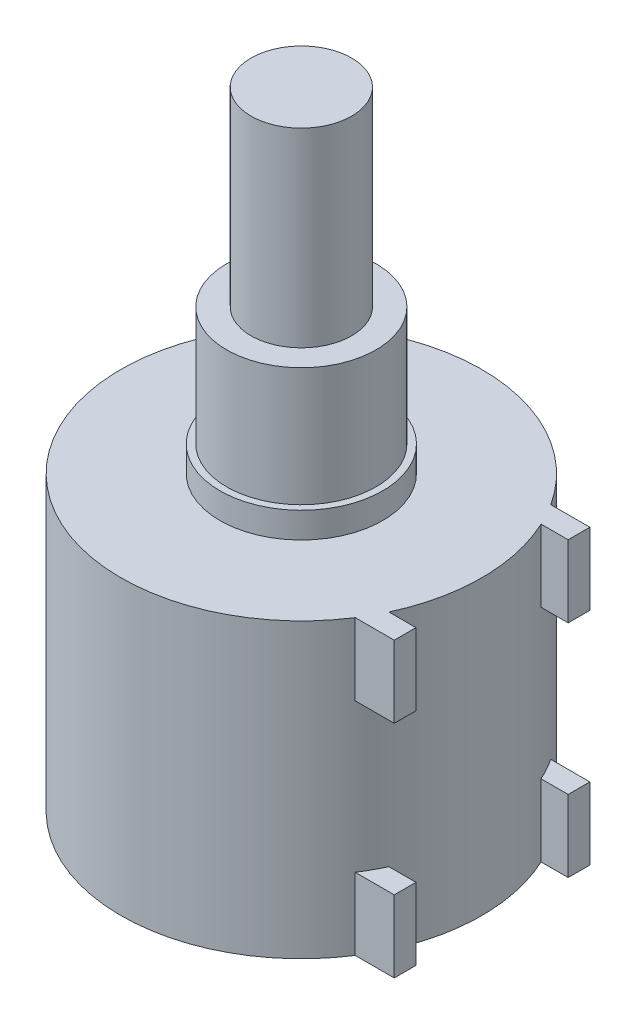
ISO-10303-21;
HEADER;
FILE_DESCRIPTION(('STEP AP214'),'2;1');
FILE_NAME('part.step','',(''),(''),'','','');
FILE_SCHEMA(('AUTOMOTIVE_DESIGN { 1 0 10303 214 1 1 1 1 }'));
ENDSEC;
DATA;
#1=APPLICATION_CONTEXT('core data for automotive mechanical design processes');
#2=APPLICATION_PROTOCOL_DEFINITION('international standard','automotive_design',2000,#1);
#3=PRODUCT_CONTEXT('',#1,'mechanical');
#4=PRODUCT('Part','Part','',(#3));
#5=PRODUCT_RELATED_PRODUCT_CATEGORY('part','',(#4));
#6=PRODUCT_DEFINITION_FORMATION('','',#4);
#7=PRODUCT_DEFINITION_CONTEXT('part definition',#1,'design');
#8=PRODUCT_DEFINITION('design','',#6,#7);
#9=PRODUCT_DEFINITION_SHAPE('','',#8);
#10=(LENGTH_UNIT() NAMED_UNIT(*) SI_UNIT(.MILLI.,.METRE.));
#11=(NAMED_UNIT(*) PLANE_ANGLE_UNIT() SI_UNIT($,.RADIAN.));
#12=(NAMED_UNIT(*) SI_UNIT($,.STERADIAN.) SOLID_ANGLE_UNIT());
#13=UNCERTAINTY_MEASURE_WITH_UNIT(LENGTH_MEASURE(1.E-05),#10,'distance_accuracy_value','');
#14=(GEOMETRIC_REPRESENTATION_CONTEXT(3) GLOBAL_UNCERTAINTY_ASSIGNED_CONTEXT((#13)) GLOBAL_UNIT_ASSIGNED_CONTEXT((#10,
#11,#12)) REPRESENTATION_CONTEXT('',''));
#15=CARTESIAN_POINT('',(0.,0.,0.));
#16=DIRECTION('',(0.,0.,1.));
#17=DIRECTION('',(1.,0.,0.));
#18=AXIS2_PLACEMENT_3D('',#15,#16,#17);
#19=CARTESIAN_POINT('',(0.,0.,0.));
#20=DIRECTION('',(0.,1.,0.));
#21=DIRECTION('',(-1.,0.,0.));
#22=AXIS2_PLACEMENT_3D('',#19,#20,#21);
#23=CYLINDRICAL_SURFACE('',#22,11.2014);
#24=CARTESIAN_POINT('',(0.,18.161,0.));
#25=DIRECTION('',(0.,1.,0.));
#26=DIRECTION('',(-1.,0.,0.));
#27=AXIS2_PLACEMENT_3D('',#24,#25,#26);
#28=CIRCLE('',#27,11.2014);
#29=CARTESIAN_POINT('',(9.4137759480455,18.161,-6.0706));
#30=VERTEX_POINT('',#29);
#31=CARTESIAN_POINT('',(9.4137759480455,18.161,6.0706));
#32=VERTEX_POINT('',#31);
#33=EDGE_CURVE('E262',#30,#32,#28,.T.);
#34=ORIENTED_EDGE('',*,*,#33,.F.);
#35=DIRECTION('',(0.,1.,0.));
#36=VECTOR('',#35,1.);
#37=CARTESIAN_POINT('',(9.4137759480455,0.,-6.0706));
#38=LINE('',#37,#36);
#39=CARTESIAN_POINT('',(9.4137759480455,13.6906,-6.0706));
#40=VERTEX_POINT('',#39);
#41=EDGE_CURVE('E187',#40,#30,#38,.T.);
#42=ORIENTED_EDGE('',*,*,#41,.F.);
#43=CARTESIAN_POINT('',(0.,13.6906,0.));
#44=DIRECTION('',(0.,1.,0.));
#45=DIRECTION('',(0.,0.,1.));
#46=AXIS2_PLACEMENT_3D('',#43,#44,#45);
#47=CIRCLE('',#46,11.2014);
#48=CARTESIAN_POINT('',(10.1563480936801,13.6906,-4.7244));
#49=VERTEX_POINT('',#48);
#50=EDGE_CURVE('E192',#49,#40,#47,.T.);
#51=ORIENTED_EDGE('',*,*,#50,.F.);
#52=DIRECTION('',(0.,1.,0.));
#53=VECTOR('',#52,1.);
#54=CARTESIAN_POINT('',(10.1563480936801,0.,-4.72440000000001));
#55=LINE('',#54,#53);
#56=CARTESIAN_POINT('',(10.1563480936801,18.161,-4.7244));
#57=VERTEX_POINT('',#56);
#58=EDGE_CURVE('E197',#57,#49,#55,.F.);
#59=ORIENTED_EDGE('',*,*,#58,.F.);
#60=CARTESIAN_POINT('',(10.1563480936801,18.161,4.7244));
#61=VERTEX_POINT('',#60);
#62=EDGE_CURVE('E158',#61,#57,#28,.T.);
#63=ORIENTED_EDGE('',*,*,#62,.F.);
#64=DIRECTION('',(0.,1.,0.));
#65=VECTOR('',#64,1.);
#66=CARTESIAN_POINT('',(10.1563480936801,0.,4.72440000000001));
#67=LINE('',#66,#65);
#68=CARTESIAN_POINT('',(10.1563480936801,13.6906,4.72440000000001));
#69=VERTEX_POINT('',#68);
#70=EDGE_CURVE('E241',#61,#69,#67,.F.);
#71=ORIENTED_EDGE('',*,*,#70,.T.);
#72=CARTESIAN_POINT('',(0.,13.6906,0.));
#73=DIRECTION('',(0.,-1.,0.));
#74=DIRECTION('',(0.,0.,-1.));
#75=AXIS2_PLACEMENT_3D('',#72,#73,#74);
#76=CIRCLE('',#75,11.2014);
#77=CARTESIAN_POINT('',(9.4137759480455,13.6906,6.0706));
#78=VERTEX_POINT('',#77);
#79=EDGE_CURVE('E253',#69,#78,#76,.T.);
#80=ORIENTED_EDGE('',*,*,#79,.T.);
#81=DIRECTION('',(0.,1.,0.));
#82=VECTOR('',#81,1.);
#83=CARTESIAN_POINT('',(9.4137759480455,0.,6.0706));
#84=LINE('',#83,#82);
#85=EDGE_CURVE('E257',#78,#32,#84,.T.);
#86=ORIENTED_EDGE('',*,*,#85,.T.);
#87=EDGE_LOOP('',(#34,#42,#51,#59,#63,#71,#80,#86));
#88=FACE_BOUND('',#87,.T.);
#89=CARTESIAN_POINT('',(0.,4.4704,0.));
#90=DIRECTION('',(0.,-1.,0.));
#91=DIRECTION('',(0.,0.,-1.));
#92=AXIS2_PLACEMENT_3D('',#89,#90,#91);
#93=CIRCLE('',#92,11.2014);
#94=CARTESIAN_POINT('',(9.4137759480455,4.4704,-6.0706));
#95=VERTEX_POINT('',#94);
#96=CARTESIAN_POINT('',(10.1563480936801,4.4704,-4.7244));
#97=VERTEX_POINT('',#96);
#98=EDGE_CURVE('E50',#95,#97,#93,.T.);
#99=ORIENTED_EDGE('',*,*,#98,.F.);
#100=DIRECTION('',(0.,1.,0.));
#101=VECTOR('',#100,1.);
#102=CARTESIAN_POINT('',(9.4137759480455,0.,-6.0706));
#103=LINE('',#102,#101);
#104=CARTESIAN_POINT('',(9.4137759480455,0.,-6.0706));
#105=VERTEX_POINT('',#104);
#106=EDGE_CURVE('E160',#105,#95,#103,.T.);
#107=ORIENTED_EDGE('',*,*,#106,.F.);
#108=CARTESIAN_POINT('',(0.,0.,0.));
#109=DIRECTION('',(0.,1.,0.));
#110=DIRECTION('',(-1.,0.,0.));
#111=AXIS2_PLACEMENT_3D('',#108,#109,#110);
#112=CIRCLE('',#111,11.2014);
#113=CARTESIAN_POINT('',(9.4137759480455,0.,6.0706));
#114=VERTEX_POINT('',#113);
#115=EDGE_CURVE('E147',#105,#114,#112,.T.);
#116=ORIENTED_EDGE('',*,*,#115,.T.);
#117=DIRECTION('',(0.,1.,0.));
#118=VECTOR('',#117,1.);
#119=CARTESIAN_POINT('',(9.4137759480455,0.,6.0706));
#120=LINE('',#119,#118);
#121=CARTESIAN_POINT('',(9.4137759480455,4.4704,6.0706));
#122=VERTEX_POINT('',#121);
#123=EDGE_CURVE('E215',#114,#122,#120,.T.);
#124=ORIENTED_EDGE('',*,*,#123,.T.);
#125=CARTESIAN_POINT('',(0.,4.4704,0.));
#126=DIRECTION('',(0.,1.,0.));
#127=DIRECTION('',(0.,0.,1.));
#128=AXIS2_PLACEMENT_3D('',#125,#126,#127);
#129=CIRCLE('',#128,11.2014);
#130=CARTESIAN_POINT('',(10.1563480936801,4.4704,4.7244));
#131=VERTEX_POINT('',#130);
#132=EDGE_CURVE('E227',#122,#131,#129,.T.);
#133=ORIENTED_EDGE('',*,*,#132,.T.);
#134=DIRECTION('',(0.,1.,0.));
#135=VECTOR('',#134,1.);
#136=CARTESIAN_POINT('',(10.1563480936801,0.,4.7244));
#137=LINE('',#136,#135);
#138=CARTESIAN_POINT('',(10.1563480936801,0.,4.7244));
#139=VERTEX_POINT('',#138);
#140=EDGE_CURVE('E231',#131,#139,#137,.F.);
#141=ORIENTED_EDGE('',*,*,#140,.T.);
#142=CARTESIAN_POINT('',(10.1563480936801,0.,-4.7244));
#143=VERTEX_POINT('',#142);
#144=EDGE_CURVE('E157',#139,#143,#112,.T.);
#145=ORIENTED_EDGE('',*,*,#144,.T.);
#146=DIRECTION('',(0.,1.,0.));
#147=VECTOR('',#146,1.);
#148=CARTESIAN_POINT('',(10.1563480936801,0.,-4.7244));
#149=LINE('',#148,#147);
#150=EDGE_CURVE('E55',#97,#143,#149,.F.);
#151=ORIENTED_EDGE('',*,*,#150,.F.);
#152=EDGE_LOOP('',(#99,#107,#116,#124,#133,#141,#145,#151));
#153=FACE_BOUND('',#152,.T.);
#154=ADVANCED_FACE('F35',(#88,#153),#23,.T.);
#155=CARTESIAN_POINT('',(-11.2014,18.161,0.));
#156=DIRECTION('',(0.,1.,0.));
#157=DIRECTION('',(-1.,0.,0.));
#158=AXIS2_PLACEMENT_3D('',#155,#156,#157);
#159=PLANE('',#158);
#160=ORIENTED_EDGE('',*,*,#62,.T.);
#161=DIRECTION('',(1.,0.,0.));
#162=VECTOR('',#161,1.);
#163=CARTESIAN_POINT('',(-11.2024,18.161,-4.7244));
#164=LINE('',#163,#162);
#165=CARTESIAN_POINT('',(11.8364,18.161,-4.7244));
#166=VERTEX_POINT('',#165);
#167=EDGE_CURVE('E188',#57,#166,#164,.T.);
#168=ORIENTED_EDGE('',*,*,#167,.T.);
#169=DIRECTION('',(0.,0.,-1.));
#170=VECTOR('',#169,1.);
#171=CARTESIAN_POINT('',(11.8364,18.161,-6.0706));
#172=LINE('',#171,#170);
#173=CARTESIAN_POINT('',(11.8364,18.161,-6.0706));
#174=VERTEX_POINT('',#173);
#175=EDGE_CURVE('E184',#166,#174,#172,.T.);
#176=ORIENTED_EDGE('',*,*,#175,.T.);
#177=DIRECTION('',(1.,0.,0.));
#178=VECTOR('',#177,1.);
#179=CARTESIAN_POINT('',(-11.2024,18.161,-6.0706));
#180=LINE('',#179,#178);
#181=EDGE_CURVE('E193',#30,#174,#180,.T.);
#182=ORIENTED_EDGE('',*,*,#181,.F.);
#183=ORIENTED_EDGE('',*,*,#33,.T.);
#184=DIRECTION('',(1.,0.,0.));
#185=VECTOR('',#184,1.);
#186=CARTESIAN_POINT('',(-11.2024,18.161,6.0706));
#187=LINE('',#186,#185);
#188=CARTESIAN_POINT('',(11.8364,18.161,6.0706));
#189=VERTEX_POINT('',#188);
#190=EDGE_CURVE('E255',#32,#189,#187,.T.);
#191=ORIENTED_EDGE('',*,*,#190,.T.);
#192=DIRECTION('',(0.,0.,1.));
#193=VECTOR('',#192,1.);
#194=CARTESIAN_POINT('',(11.8364,18.161,6.0706));
#195=LINE('',#194,#193);
#196=CARTESIAN_POINT('',(11.8364,18.161,4.7244));
#197=VERTEX_POINT('',#196);
#198=EDGE_CURVE('E245',#197,#189,#195,.T.);
#199=ORIENTED_EDGE('',*,*,#198,.F.);
#200=DIRECTION('',(1.,0.,0.));
#201=VECTOR('',#200,1.);
#202=CARTESIAN_POINT('',(-11.2024,18.161,4.7244));
#203=LINE('',#202,#201);
#204=EDGE_CURVE('E251',#61,#197,#203,.T.);
#205=ORIENTED_EDGE('',*,*,#204,.F.);
#206=EDGE_LOOP('',(#160,#168,#176,#182,#183,#191,#199,#205));
#207=FACE_BOUND('',#206,.T.);
#208=CARTESIAN_POINT('',(0.,18.161,0.));
#209=DIRECTION('',(0.,1.,0.));
#210=DIRECTION('',(-1.,0.,0.));
#211=AXIS2_PLACEMENT_3D('',#208,#209,#210);
#212=CIRCLE('',#211,5.0546);
#213=CARTESIAN_POINT('',(-5.0546,18.161,0.));
#214=VERTEX_POINT('',#213);
#215=EDGE_CURVE('E11',#214,#214,#212,.T.);
#216=ORIENTED_EDGE('',*,*,#215,.F.);
#217=EDGE_LOOP('',(#216));
#218=FACE_BOUND('',#217,.T.);
#219=ADVANCED_FACE('F37',(#207,#218),#159,.T.);
#220=CARTESIAN_POINT('',(0.,0.,0.));
#221=DIRECTION('',(0.,1.,0.));
#222=DIRECTION('',(-1.,0.,0.));
#223=AXIS2_PLACEMENT_3D('',#220,#221,#222);
#224=CYLINDRICAL_SURFACE('',#223,5.0546);
#225=ORIENTED_EDGE('',*,*,#215,.T.);
#226=EDGE_LOOP('',(#225));
#227=FACE_BOUND('',#226,.T.);
#228=CARTESIAN_POINT('',(0.,19.7612,0.));
#229=DIRECTION('',(0.,1.,0.));
#230=DIRECTION('',(-1.,0.,0.));
#231=AXIS2_PLACEMENT_3D('',#228,#229,#230);
#232=CIRCLE('',#231,5.0546);
#233=CARTESIAN_POINT('',(-5.0546,19.7612,0.));
#234=VERTEX_POINT('',#233);
#235=EDGE_CURVE('E43',#234,#234,#232,.T.);
#236=ORIENTED_EDGE('',*,*,#235,.F.);
#237=EDGE_LOOP('',(#236));
#238=FACE_BOUND('',#237,.T.);
#239=ADVANCED_FACE('F284',(#227,#238),#224,.T.);
#240=CARTESIAN_POINT('',(-4.6355,19.7612,0.));
#241=DIRECTION('',(0.,1.,0.));
#242=DIRECTION('',(-1.,0.,0.));
#243=AXIS2_PLACEMENT_3D('',#240,#241,#242);
#244=PLANE('',#243);
#245=ORIENTED_EDGE('',*,*,#235,.T.);
#246=EDGE_LOOP('',(#245));
#247=FACE_BOUND('',#246,.T.);
#248=CARTESIAN_POINT('',(0.,19.7612,0.));
#249=DIRECTION('',(0.,1.,0.));
#250=DIRECTION('',(-1.,0.,0.));
#251=AXIS2_PLACEMENT_3D('',#248,#249,#250);
#252=CIRCLE('',#251,4.6355);
#253=CARTESIAN_POINT('',(-4.6355,19.7612,0.));
#254=VERTEX_POINT('',#253);
#255=EDGE_CURVE('E276',#254,#254,#252,.T.);
#256=ORIENTED_EDGE('',*,*,#255,.F.);
#257=EDGE_LOOP('',(#256));
#258=FACE_BOUND('',#257,.T.);
#259=ADVANCED_FACE('F281',(#247,#258),#244,.T.);
#260=CARTESIAN_POINT('',(0.,0.,0.));
#261=DIRECTION('',(0.,1.,0.));
#262=DIRECTION('',(-1.,0.,0.));
#263=AXIS2_PLACEMENT_3D('',#260,#261,#262);
#264=CYLINDRICAL_SURFACE('',#263,4.6355);
#265=ORIENTED_EDGE('',*,*,#255,.T.);
#266=EDGE_LOOP('',(#265));
#267=FACE_BOUND('',#266,.T.);
#268=CARTESIAN_POINT('',(0.,27.1272,0.));
#269=DIRECTION('',(0.,1.,0.));
#270=DIRECTION('',(-1.,0.,0.));
#271=AXIS2_PLACEMENT_3D('',#268,#269,#270);
#272=CIRCLE('',#271,4.6355);
#273=CARTESIAN_POINT('',(-4.6355,27.1272,0.));
#274=VERTEX_POINT('',#273);
#275=EDGE_CURVE('E273',#274,#274,#272,.T.);
#276=ORIENTED_EDGE('',*,*,#275,.F.);
#277=EDGE_LOOP('',(#276));
#278=FACE_BOUND('',#277,.T.);
#279=ADVANCED_FACE('F291',(#267,#278),#264,.T.);
#280=CARTESIAN_POINT('',(-4.6355,27.1272,0.));
#281=DIRECTION('',(0.,1.,0.));
#282=DIRECTION('',(-1.,0.,0.));
#283=AXIS2_PLACEMENT_3D('',#280,#281,#282);
#284=PLANE('',#283);
#285=ORIENTED_EDGE('',*,*,#275,.T.);
#286=EDGE_LOOP('',(#285));
#287=FACE_BOUND('',#286,.T.);
#288=CARTESIAN_POINT('',(0.,27.1272,0.));
#289=DIRECTION('',(0.,1.,0.));
#290=DIRECTION('',(-1.,0.,0.));
#291=AXIS2_PLACEMENT_3D('',#288,#289,#290);
#292=CIRCLE('',#291,3.1242);
#293=CARTESIAN_POINT('',(-3.1242,27.1272,0.));
#294=VERTEX_POINT('',#293);
#295=EDGE_CURVE('E270',#294,#294,#292,.T.);
#296=ORIENTED_EDGE('',*,*,#295,.F.);
#297=EDGE_LOOP('',(#296));
#298=FACE_BOUND('',#297,.T.);
#299=ADVANCED_FACE('F314',(#287,#298),#284,.T.);
#300=CARTESIAN_POINT('',(0.,0.,0.));
#301=DIRECTION('',(0.,1.,0.));
#302=DIRECTION('',(-1.,0.,0.));
#303=AXIS2_PLACEMENT_3D('',#300,#301,#302);
#304=CYLINDRICAL_SURFACE('',#303,3.1242);
#305=ORIENTED_EDGE('',*,*,#295,.T.);
#306=EDGE_LOOP('',(#305));
#307=FACE_BOUND('',#306,.T.);
#308=CARTESIAN_POINT('',(0.,38.9382,0.));
#309=DIRECTION('',(0.,1.,0.));
#310=DIRECTION('',(-1.,0.,0.));
#311=AXIS2_PLACEMENT_3D('',#308,#309,#310);
#312=CIRCLE('',#311,3.1242);
#313=CARTESIAN_POINT('',(-3.1242,38.9382,0.));
#314=VERTEX_POINT('',#313);
#315=EDGE_CURVE('E267',#314,#314,#312,.T.);
#316=ORIENTED_EDGE('',*,*,#315,.F.);
#317=EDGE_LOOP('',(#316));
#318=FACE_BOUND('',#317,.T.);
#319=ADVANCED_FACE('F310',(#307,#318),#304,.T.);
#320=CARTESIAN_POINT('',(-3.1242,38.9382,0.));
#321=DIRECTION('',(0.,1.,0.));
#322=DIRECTION('',(-1.,0.,0.));
#323=AXIS2_PLACEMENT_3D('',#320,#321,#322);
#324=PLANE('',#323);
#325=ORIENTED_EDGE('',*,*,#315,.T.);
#326=EDGE_LOOP('',(#325));
#327=FACE_BOUND('',#326,.T.);
#328=ADVANCED_FACE('F307',(#327),#324,.T.);
#329=CARTESIAN_POINT('',(-11.2014,0.,0.));
#330=DIRECTION('',(0.,-1.,0.));
#331=DIRECTION('',(1.,0.,0.));
#332=AXIS2_PLACEMENT_3D('',#329,#330,#331);
#333=PLANE('',#332);
#334=ORIENTED_EDGE('',*,*,#144,.F.);
#335=DIRECTION('',(1.,0.,0.));
#336=VECTOR('',#335,1.);
#337=CARTESIAN_POINT('',(-11.2024,0.,4.7244));
#338=LINE('',#337,#336);
#339=CARTESIAN_POINT('',(11.8364,0.,4.7244));
#340=VERTEX_POINT('',#339);
#341=EDGE_CURVE('E233',#139,#340,#338,.T.);
#342=ORIENTED_EDGE('',*,*,#341,.T.);
#343=DIRECTION('',(0.,0.,-1.));
#344=VECTOR('',#343,1.);
#345=CARTESIAN_POINT('',(11.8364,0.,6.0706));
#346=LINE('',#345,#344);
#347=CARTESIAN_POINT('',(11.8364,0.,6.0706));
#348=VERTEX_POINT('',#347);
#349=EDGE_CURVE('E219',#348,#340,#346,.T.);
#350=ORIENTED_EDGE('',*,*,#349,.F.);
#351=DIRECTION('',(1.,0.,0.));
#352=VECTOR('',#351,1.);
#353=CARTESIAN_POINT('',(-11.2024,0.,6.0706));
#354=LINE('',#353,#352);
#355=EDGE_CURVE('E155',#114,#348,#354,.T.);
#356=ORIENTED_EDGE('',*,*,#355,.F.);
#357=ORIENTED_EDGE('',*,*,#115,.F.);
#358=DIRECTION('',(1.,0.,0.));
#359=VECTOR('',#358,1.);
#360=CARTESIAN_POINT('',(-11.2024,0.,-6.0706));
#361=LINE('',#360,#359);
#362=CARTESIAN_POINT('',(11.8364,0.,-6.0706));
#363=VERTEX_POINT('',#362);
#364=EDGE_CURVE('E152',#105,#363,#361,.T.);
#365=ORIENTED_EDGE('',*,*,#364,.T.);
#366=DIRECTION('',(0.,0.,1.));
#367=VECTOR('',#366,1.);
#368=CARTESIAN_POINT('',(11.8364,0.,-6.0706));
#369=LINE('',#368,#367);
#370=CARTESIAN_POINT('',(11.8364,0.,-4.7244));
#371=VERTEX_POINT('',#370);
#372=EDGE_CURVE('E169',#363,#371,#369,.T.);
#373=ORIENTED_EDGE('',*,*,#372,.T.);
#374=DIRECTION('',(1.,0.,0.));
#375=VECTOR('',#374,1.);
#376=CARTESIAN_POINT('',(-11.2024,0.,-4.7244));
#377=LINE('',#376,#375);
#378=EDGE_CURVE('E175',#143,#371,#377,.T.);
#379=ORIENTED_EDGE('',*,*,#378,.F.);
#380=EDGE_LOOP('',(#334,#342,#350,#356,#357,#365,#373,#379));
#381=FACE_BOUND('',#380,.T.);
#382=ADVANCED_FACE('F149',(#381),#333,.T.);
#383=CARTESIAN_POINT('',(-11.2024,13.6906,6.0706));
#384=DIRECTION('',(0.,-1.,0.));
#385=DIRECTION('',(0.,0.,-1.));
#386=AXIS2_PLACEMENT_3D('',#383,#384,#385);
#387=PLANE('',#386);
#388=ORIENTED_EDGE('',*,*,#79,.F.);
#389=DIRECTION('',(1.,0.,0.));
#390=VECTOR('',#389,1.);
#391=CARTESIAN_POINT('',(-11.2024,13.6906,4.7244));
#392=LINE('',#391,#390);
#393=CARTESIAN_POINT('',(11.8364,13.6906,4.7244));
#394=VERTEX_POINT('',#393);
#395=EDGE_CURVE('E235',#69,#394,#392,.T.);
#396=ORIENTED_EDGE('',*,*,#395,.T.);
#397=DIRECTION('',(0.,0.,-1.));
#398=VECTOR('',#397,1.);
#399=CARTESIAN_POINT('',(11.8364,13.6906,6.0706));
#400=LINE('',#399,#398);
#401=CARTESIAN_POINT('',(11.8364,13.6906,6.0706));
#402=VERTEX_POINT('',#401);
#403=EDGE_CURVE('E238',#402,#394,#400,.T.);
#404=ORIENTED_EDGE('',*,*,#403,.F.);
#405=DIRECTION('',(1.,0.,0.));
#406=VECTOR('',#405,1.);
#407=CARTESIAN_POINT('',(-11.2024,13.6906,6.0706));
#408=LINE('',#407,#406);
#409=EDGE_CURVE('E259',#78,#402,#408,.T.);
#410=ORIENTED_EDGE('',*,*,#409,.F.);
#411=EDGE_LOOP('',(#388,#396,#404,#410));
#412=FACE_BOUND('',#411,.T.);
#413=ADVANCED_FACE('F306',(#412),#387,.T.);
#414=CARTESIAN_POINT('',(-11.2024,18.161,6.0706));
#415=DIRECTION('',(0.,0.,1.));
#416=DIRECTION('',(1.,0.,0.));
#417=AXIS2_PLACEMENT_3D('',#414,#415,#416);
#418=PLANE('',#417);
#419=ORIENTED_EDGE('',*,*,#85,.F.);
#420=ORIENTED_EDGE('',*,*,#409,.T.);
#421=DIRECTION('',(0.,-1.,0.));
#422=VECTOR('',#421,1.);
#423=CARTESIAN_POINT('',(11.8364,18.161,6.0706));
#424=LINE('',#423,#422);
#425=EDGE_CURVE('E242',#189,#402,#424,.T.);
#426=ORIENTED_EDGE('',*,*,#425,.F.);
#427=ORIENTED_EDGE('',*,*,#190,.F.);
#428=EDGE_LOOP('',(#419,#420,#426,#427));
#429=FACE_BOUND('',#428,.T.);
#430=ADVANCED_FACE('F356',(#429),#418,.T.);
#431=CARTESIAN_POINT('',(-11.2024,18.161,4.7244));
#432=DIRECTION('',(0.,0.,-1.));
#433=DIRECTION('',(0.,1.,0.));
#434=AXIS2_PLACEMENT_3D('',#431,#432,#433);
#435=PLANE('',#434);
#436=ORIENTED_EDGE('',*,*,#70,.F.);
#437=ORIENTED_EDGE('',*,*,#204,.T.);
#438=DIRECTION('',(0.,1.,0.));
#439=VECTOR('',#438,1.);
#440=CARTESIAN_POINT('',(11.8364,18.161,4.7244));
#441=LINE('',#440,#439);
#442=EDGE_CURVE('E248',#394,#197,#441,.T.);
#443=ORIENTED_EDGE('',*,*,#442,.F.);
#444=ORIENTED_EDGE('',*,*,#395,.F.);
#445=EDGE_LOOP('',(#436,#437,#443,#444));
#446=FACE_BOUND('',#445,.T.);
#447=ADVANCED_FACE('F302',(#446),#435,.T.);
#448=CARTESIAN_POINT('',(11.8364,0.,0.));
#449=DIRECTION('',(1.,0.,0.));
#450=DIRECTION('',(0.,0.,-1.));
#451=AXIS2_PLACEMENT_3D('',#448,#449,#450);
#452=PLANE('',#451);
#453=ORIENTED_EDGE('',*,*,#442,.T.);
#454=ORIENTED_EDGE('',*,*,#198,.T.);
#455=ORIENTED_EDGE('',*,*,#425,.T.);
#456=ORIENTED_EDGE('',*,*,#403,.T.);
#457=EDGE_LOOP('',(#453,#454,#455,#456));
#458=FACE_BOUND('',#457,.T.);
#459=ADVANCED_FACE('F370',(#458),#452,.T.);
#460=CARTESIAN_POINT('',(-11.2024,0.,6.0706));
#461=DIRECTION('',(0.,0.,1.));
#462=DIRECTION('',(1.,0.,0.));
#463=AXIS2_PLACEMENT_3D('',#460,#461,#462);
#464=PLANE('',#463);
#465=ORIENTED_EDGE('',*,*,#123,.F.);
#466=ORIENTED_EDGE('',*,*,#355,.T.);
#467=DIRECTION('',(0.,-1.,0.));
#468=VECTOR('',#467,1.);
#469=CARTESIAN_POINT('',(11.8364,0.,6.0706));
#470=LINE('',#469,#468);
#471=CARTESIAN_POINT('',(11.8364,4.4704,6.0706));
#472=VERTEX_POINT('',#471);
#473=EDGE_CURVE('E222',#472,#348,#470,.T.);
#474=ORIENTED_EDGE('',*,*,#473,.F.);
#475=DIRECTION('',(1.,0.,0.));
#476=VECTOR('',#475,1.);
#477=CARTESIAN_POINT('',(-11.2024,4.4704,6.0706));
#478=LINE('',#477,#476);
#479=EDGE_CURVE('E229',#122,#472,#478,.T.);
#480=ORIENTED_EDGE('',*,*,#479,.F.);
#481=EDGE_LOOP('',(#465,#466,#474,#480));
#482=FACE_BOUND('',#481,.T.);
#483=ADVANCED_FACE('F377',(#482),#464,.T.);
#484=CARTESIAN_POINT('',(-11.2024,4.4704,6.0706));
#485=DIRECTION('',(0.,1.,0.));
#486=DIRECTION('',(0.,0.,1.));
#487=AXIS2_PLACEMENT_3D('',#484,#485,#486);
#488=PLANE('',#487);
#489=ORIENTED_EDGE('',*,*,#132,.F.);
#490=ORIENTED_EDGE('',*,*,#479,.T.);
#491=DIRECTION('',(0.,0.,1.));
#492=VECTOR('',#491,1.);
#493=CARTESIAN_POINT('',(11.8364,4.4704,6.0706));
#494=LINE('',#493,#492);
#495=CARTESIAN_POINT('',(11.8364,4.4704,4.7244));
#496=VERTEX_POINT('',#495);
#497=EDGE_CURVE('E212',#496,#472,#494,.T.);
#498=ORIENTED_EDGE('',*,*,#497,.F.);
#499=DIRECTION('',(1.,0.,0.));
#500=VECTOR('',#499,1.);
#501=CARTESIAN_POINT('',(-11.2024,4.4704,4.7244));
#502=LINE('',#501,#500);
#503=EDGE_CURVE('E225',#131,#496,#502,.T.);
#504=ORIENTED_EDGE('',*,*,#503,.F.);
#505=EDGE_LOOP('',(#489,#490,#498,#504));
#506=FACE_BOUND('',#505,.T.);
#507=ADVANCED_FACE('F385',(#506),#488,.T.);
#508=CARTESIAN_POINT('',(-11.2024,0.,4.7244));
#509=DIRECTION('',(0.,0.,-1.));
#510=DIRECTION('',(0.,1.,0.));
#511=AXIS2_PLACEMENT_3D('',#508,#509,#510);
#512=PLANE('',#511);
#513=ORIENTED_EDGE('',*,*,#140,.F.);
#514=ORIENTED_EDGE('',*,*,#503,.T.);
#515=DIRECTION('',(0.,1.,0.));
#516=VECTOR('',#515,1.);
#517=CARTESIAN_POINT('',(11.8364,0.,4.7244));
#518=LINE('',#517,#516);
#519=EDGE_CURVE('E216',#340,#496,#518,.T.);
#520=ORIENTED_EDGE('',*,*,#519,.F.);
#521=ORIENTED_EDGE('',*,*,#341,.F.);
#522=EDGE_LOOP('',(#513,#514,#520,#521));
#523=FACE_BOUND('',#522,.T.);
#524=ADVANCED_FACE('F393',(#523),#512,.T.);
#525=CARTESIAN_POINT('',(11.8364,0.,0.));
#526=DIRECTION('',(-1.,0.,0.));
#527=DIRECTION('',(0.,0.,1.));
#528=AXIS2_PLACEMENT_3D('',#525,#526,#527);
#529=PLANE('',#528);
#530=ORIENTED_EDGE('',*,*,#473,.T.);
#531=ORIENTED_EDGE('',*,*,#349,.T.);
#532=ORIENTED_EDGE('',*,*,#519,.T.);
#533=ORIENTED_EDGE('',*,*,#497,.T.);
#534=EDGE_LOOP('',(#530,#531,#532,#533));
#535=FACE_BOUND('',#534,.T.);
#536=ADVANCED_FACE('F401',(#535),#529,.F.);
#537=CARTESIAN_POINT('',(-11.2024,18.161,-6.0706));
#538=DIRECTION('',(0.,0.,1.));
#539=DIRECTION('',(1.,0.,0.));
#540=AXIS2_PLACEMENT_3D('',#537,#538,#539);
#541=PLANE('',#540);
#542=DIRECTION('',(1.,0.,0.));
#543=VECTOR('',#542,1.);
#544=CARTESIAN_POINT('',(-11.2024,13.6906,-6.0706));
#545=LINE('',#544,#543);
#546=CARTESIAN_POINT('',(11.8364,13.6906,-6.0706));
#547=VERTEX_POINT('',#546);
#548=EDGE_CURVE('E198',#40,#547,#545,.T.);
#549=ORIENTED_EDGE('',*,*,#548,.F.);
#550=ORIENTED_EDGE('',*,*,#41,.T.);
#551=ORIENTED_EDGE('',*,*,#181,.T.);
#552=DIRECTION('',(0.,-1.,0.));
#553=VECTOR('',#552,1.);
#554=CARTESIAN_POINT('',(11.8364,18.161,-6.0706));
#555=LINE('',#554,#553);
#556=EDGE_CURVE('E189',#174,#547,#555,.T.);
#557=ORIENTED_EDGE('',*,*,#556,.T.);
#558=EDGE_LOOP('',(#549,#550,#551,#557));
#559=FACE_BOUND('',#558,.T.);
#560=ADVANCED_FACE('F409',(#559),#541,.F.);
#561=CARTESIAN_POINT('',(-11.2024,13.6906,-6.0706));
#562=DIRECTION('',(0.,1.,0.));
#563=DIRECTION('',(0.,0.,1.));
#564=AXIS2_PLACEMENT_3D('',#561,#562,#563);
#565=PLANE('',#564);
#566=DIRECTION('',(1.,0.,0.));
#567=VECTOR('',#566,1.);
#568=CARTESIAN_POINT('',(-11.2024,13.6906,-4.7244));
#569=LINE('',#568,#567);
#570=CARTESIAN_POINT('',(11.8364,13.6906,-4.7244));
#571=VERTEX_POINT('',#570);
#572=EDGE_CURVE('E202',#49,#571,#569,.T.);
#573=ORIENTED_EDGE('',*,*,#572,.F.);
#574=ORIENTED_EDGE('',*,*,#50,.T.);
#575=ORIENTED_EDGE('',*,*,#548,.T.);
#576=DIRECTION('',(0.,0.,1.));
#577=VECTOR('',#576,1.);
#578=CARTESIAN_POINT('',(11.8364,13.6906,-6.0706));
#579=LINE('',#578,#577);
#580=EDGE_CURVE('E194',#547,#571,#579,.T.);
#581=ORIENTED_EDGE('',*,*,#580,.T.);
#582=EDGE_LOOP('',(#573,#574,#575,#581));
#583=FACE_BOUND('',#582,.T.);
#584=ADVANCED_FACE('F416',(#583),#565,.F.);
#585=CARTESIAN_POINT('',(-11.2024,18.161,-4.7244));
#586=DIRECTION('',(0.,0.,-1.));
#587=DIRECTION('',(0.,1.,0.));
#588=AXIS2_PLACEMENT_3D('',#585,#586,#587);
#589=PLANE('',#588);
#590=ORIENTED_EDGE('',*,*,#167,.F.);
#591=ORIENTED_EDGE('',*,*,#58,.T.);
#592=ORIENTED_EDGE('',*,*,#572,.T.);
#593=DIRECTION('',(0.,1.,0.));
#594=VECTOR('',#593,1.);
#595=CARTESIAN_POINT('',(11.8364,18.161,-4.7244));
#596=LINE('',#595,#594);
#597=EDGE_CURVE('E199',#571,#166,#596,.T.);
#598=ORIENTED_EDGE('',*,*,#597,.T.);
#599=EDGE_LOOP('',(#590,#591,#592,#598));
#600=FACE_BOUND('',#599,.T.);
#601=ADVANCED_FACE('F424',(#600),#589,.F.);
#602=CARTESIAN_POINT('',(11.8364,0.,0.));
#603=DIRECTION('',(1.,0.,0.));
#604=DIRECTION('',(0.,0.,1.));
#605=AXIS2_PLACEMENT_3D('',#602,#603,#604);
#606=PLANE('',#605);
#607=ORIENTED_EDGE('',*,*,#597,.F.);
#608=ORIENTED_EDGE('',*,*,#580,.F.);
#609=ORIENTED_EDGE('',*,*,#556,.F.);
#610=ORIENTED_EDGE('',*,*,#175,.F.);
#611=EDGE_LOOP('',(#607,#608,#609,#610));
#612=FACE_BOUND('',#611,.T.);
#613=ADVANCED_FACE('F432',(#612),#606,.T.);
#614=CARTESIAN_POINT('',(-11.2024,0.,-6.0706));
#615=DIRECTION('',(0.,0.,1.));
#616=DIRECTION('',(1.,0.,0.));
#617=AXIS2_PLACEMENT_3D('',#614,#615,#616);
#618=PLANE('',#617);
#619=ORIENTED_EDGE('',*,*,#364,.F.);
#620=ORIENTED_EDGE('',*,*,#106,.T.);
#621=DIRECTION('',(1.,0.,0.));
#622=VECTOR('',#621,1.);
#623=CARTESIAN_POINT('',(-11.2024,4.4704,-6.0706));
#624=LINE('',#623,#622);
#625=CARTESIAN_POINT('',(11.8364,4.4704,-6.0706));
#626=VERTEX_POINT('',#625);
#627=EDGE_CURVE('E163',#95,#626,#624,.T.);
#628=ORIENTED_EDGE('',*,*,#627,.T.);
#629=DIRECTION('',(0.,-1.,0.));
#630=VECTOR('',#629,1.);
#631=CARTESIAN_POINT('',(11.8364,0.,-6.0706));
#632=LINE('',#631,#630);
#633=EDGE_CURVE('E168',#626,#363,#632,.T.);
#634=ORIENTED_EDGE('',*,*,#633,.T.);
#635=EDGE_LOOP('',(#619,#620,#628,#634));
#636=FACE_BOUND('',#635,.T.);
#637=ADVANCED_FACE('F166',(#636),#618,.F.);
#638=CARTESIAN_POINT('',(-11.2024,4.4704,-6.0706));
#639=DIRECTION('',(0.,-1.,0.));
#640=DIRECTION('',(0.,0.,-1.));
#641=AXIS2_PLACEMENT_3D('',#638,#639,#640);
#642=PLANE('',#641);
#643=ORIENTED_EDGE('',*,*,#627,.F.);
#644=ORIENTED_EDGE('',*,*,#98,.T.);
#645=DIRECTION('',(1.,0.,0.));
#646=VECTOR('',#645,1.);
#647=CARTESIAN_POINT('',(-11.2024,4.4704,-4.7244));
#648=LINE('',#647,#646);
#649=CARTESIAN_POINT('',(11.8364,4.4704,-4.7244));
#650=VERTEX_POINT('',#649);
#651=EDGE_CURVE('E178',#97,#650,#648,.T.);
#652=ORIENTED_EDGE('',*,*,#651,.T.);
#653=DIRECTION('',(0.,0.,-1.));
#654=VECTOR('',#653,1.);
#655=CARTESIAN_POINT('',(11.8364,4.4704,-6.0706));
#656=LINE('',#655,#654);
#657=EDGE_CURVE('E180',#650,#626,#656,.T.);
#658=ORIENTED_EDGE('',*,*,#657,.T.);
#659=EDGE_LOOP('',(#643,#644,#652,#658));
#660=FACE_BOUND('',#659,.T.);
#661=ADVANCED_FACE('F447',(#660),#642,.F.);
#662=CARTESIAN_POINT('',(-11.2024,0.,-4.7244));
#663=DIRECTION('',(0.,0.,-1.));
#664=DIRECTION('',(0.,1.,0.));
#665=AXIS2_PLACEMENT_3D('',#662,#663,#664);
#666=PLANE('',#665);
#667=ORIENTED_EDGE('',*,*,#651,.F.);
#668=ORIENTED_EDGE('',*,*,#150,.T.);
#669=ORIENTED_EDGE('',*,*,#378,.T.);
#670=DIRECTION('',(0.,1.,0.));
#671=VECTOR('',#670,1.);
#672=CARTESIAN_POINT('',(11.8364,0.,-4.7244));
#673=LINE('',#672,#671);
#674=EDGE_CURVE('E177',#371,#650,#673,.T.);
#675=ORIENTED_EDGE('',*,*,#674,.T.);
#676=EDGE_LOOP('',(#667,#668,#669,#675));
#677=FACE_BOUND('',#676,.T.);
#678=ADVANCED_FACE('F454',(#677),#666,.F.);
#679=CARTESIAN_POINT('',(11.8364,0.,0.));
#680=DIRECTION('',(-1.,0.,0.));
#681=DIRECTION('',(0.,0.,-1.));
#682=AXIS2_PLACEMENT_3D('',#679,#680,#681);
#683=PLANE('',#682);
#684=ORIENTED_EDGE('',*,*,#633,.F.);
#685=ORIENTED_EDGE('',*,*,#657,.F.);
#686=ORIENTED_EDGE('',*,*,#674,.F.);
#687=ORIENTED_EDGE('',*,*,#372,.F.);
#688=EDGE_LOOP('',(#684,#685,#686,#687));
#689=FACE_BOUND('',#688,.T.);
#690=ADVANCED_FACE('F462',(#689),#683,.F.);
#691=CLOSED_SHELL('',(#154,#219,#239,#259,#279,#299,#319,#328,#382,#413,#430,#447,#459,#483,
#507,#524,#536,#560,#584,#601,#613,#637,#661,#678,#690));
#692=MANIFOLD_SOLID_BREP('B2',#691);
#693=ADVANCED_BREP_SHAPE_REPRESENTATION('',(#18,#692),#14);
#694=SHAPE_DEFINITION_REPRESENTATION(#9,#693);
ENDSEC;
END-ISO-10303-21;
